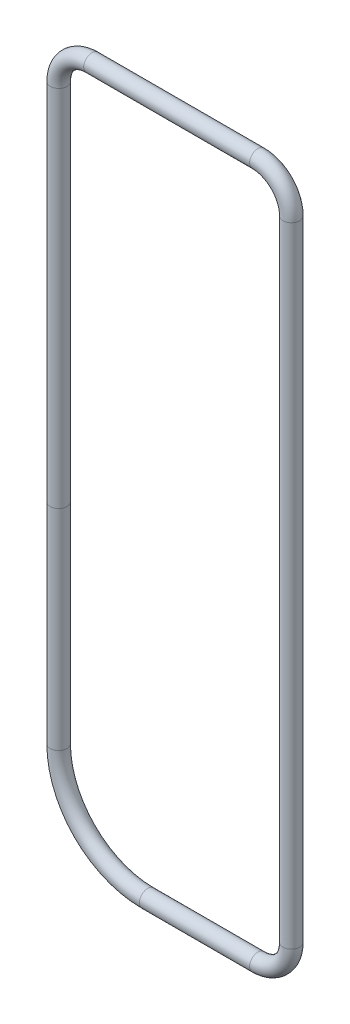
ISO-10303-21;
HEADER;
FILE_DESCRIPTION(('STEP AP214'),'2;1');
FILE_NAME('part.step','',(''),(''),'','','');
FILE_SCHEMA(('AUTOMOTIVE_DESIGN { 1 0 10303 214 1 1 1 1 }'));
ENDSEC;
DATA;
#1=APPLICATION_CONTEXT('core data for automotive mechanical design processes');
#2=APPLICATION_PROTOCOL_DEFINITION('international standard','automotive_design',2000,#1);
#3=PRODUCT_CONTEXT('',#1,'mechanical');
#4=PRODUCT('Part','Part','',(#3));
#5=PRODUCT_RELATED_PRODUCT_CATEGORY('part','',(#4));
#6=PRODUCT_DEFINITION_FORMATION('','',#4);
#7=PRODUCT_DEFINITION_CONTEXT('part definition',#1,'design');
#8=PRODUCT_DEFINITION('design','',#6,#7);
#9=PRODUCT_DEFINITION_SHAPE('','',#8);
#10=(LENGTH_UNIT() NAMED_UNIT(*) SI_UNIT(.MILLI.,.METRE.));
#11=(NAMED_UNIT(*) PLANE_ANGLE_UNIT() SI_UNIT($,.RADIAN.));
#12=(NAMED_UNIT(*) SI_UNIT($,.STERADIAN.) SOLID_ANGLE_UNIT());
#13=UNCERTAINTY_MEASURE_WITH_UNIT(LENGTH_MEASURE(1.E-05),#10,'distance_accuracy_value','');
#14=(GEOMETRIC_REPRESENTATION_CONTEXT(3) GLOBAL_UNCERTAINTY_ASSIGNED_CONTEXT((#13)) GLOBAL_UNIT_ASSIGNED_CONTEXT((#10,
#11,#12)) REPRESENTATION_CONTEXT('',''));
#15=CARTESIAN_POINT('',(0.,0.,0.));
#16=DIRECTION('',(0.,0.,1.));
#17=DIRECTION('',(1.,0.,0.));
#18=AXIS2_PLACEMENT_3D('',#15,#16,#17);
#19=CARTESIAN_POINT('',(-23.2360217079973,-37.6419311072586,0.));
#20=DIRECTION('',(0.,1.,0.));
#21=DIRECTION('',(0.,0.,1.));
#22=AXIS2_PLACEMENT_3D('',#19,#20,#21);
#23=CYLINDRICAL_SURFACE('',#22,1.5);
#24=CARTESIAN_POINT('',(-23.2360217079973,0.,0.));
#25=DIRECTION('',(0.,1.,0.));
#26=DIRECTION('',(0.,0.,1.));
#27=AXIS2_PLACEMENT_3D('',#24,#25,#26);
#28=CIRCLE('',#27,1.5);
#29=CARTESIAN_POINT('',(-23.2360217079973,0.,1.5));
#30=VERTEX_POINT('',#29);
#31=EDGE_CURVE('E67',#30,#30,#28,.T.);
#32=ORIENTED_EDGE('',*,*,#31,.F.);
#33=EDGE_LOOP('',(#32));
#34=FACE_BOUND('',#33,.T.);
#35=CARTESIAN_POINT('',(-23.2360217079973,-37.6419311072586,0.));
#36=DIRECTION('',(0.,1.,0.));
#37=DIRECTION('',(0.,0.,1.));
#38=AXIS2_PLACEMENT_3D('',#35,#36,#37);
#39=CIRCLE('',#38,1.5);
#40=CARTESIAN_POINT('',(-24.7360217079973,-37.6419311072586,0.));
#41=VERTEX_POINT('',#40);
#42=EDGE_CURVE('E10',#41,#41,#39,.T.);
#43=ORIENTED_EDGE('',*,*,#42,.T.);
#44=EDGE_LOOP('',(#43));
#45=FACE_BOUND('',#44,.T.);
#46=ADVANCED_FACE('F36',(#34,#45),#23,.T.);
#47=CARTESIAN_POINT('',(-7.23602170799728,-37.6419311072586,0.));
#48=DIRECTION('',(0.,0.,-1.));
#49=DIRECTION('',(-1.,0.,0.));
#50=AXIS2_PLACEMENT_3D('',#47,#48,#49);
#51=TOROIDAL_SURFACE('',#50,16.,1.5);
#52=CARTESIAN_POINT('',(-7.23602170799728,-53.6419311072586,0.));
#53=DIRECTION('',(-1.,0.,0.));
#54=DIRECTION('',(0.,0.,1.));
#55=AXIS2_PLACEMENT_3D('',#52,#53,#54);
#56=CIRCLE('',#55,1.5);
#57=CARTESIAN_POINT('',(-7.23602170799728,-55.1419311072586,0.));
#58=VERTEX_POINT('',#57);
#59=EDGE_CURVE('E42',#58,#58,#56,.T.);
#60=CARTESIAN_POINT('',(-7.23602170799728,-37.6419311072586,0.));
#61=DIRECTION('',(0.,0.,-1.));
#62=DIRECTION('',(-1.,0.,0.));
#63=AXIS2_PLACEMENT_3D('',#60,#61,#62);
#64=CIRCLE('',#63,17.5);
#65=EDGE_CURVE('',#58,#41,#64,.T.);
#66=ORIENTED_EDGE('',*,*,#59,.T.);
#67=ORIENTED_EDGE('',*,*,#42,.F.);
#68=ORIENTED_EDGE('',*,*,#65,.T.);
#69=ORIENTED_EDGE('',*,*,#65,.F.);
#70=EDGE_LOOP('',(#66,#68,#67,#69));
#71=FACE_BOUND('',#70,.T.);
#72=ADVANCED_FACE('F74',(#71),#51,.T.);
#73=CARTESIAN_POINT('',(12.5639782920027,-53.6419311072586,0.));
#74=DIRECTION('',(-1.,0.,0.));
#75=DIRECTION('',(0.,0.,1.));
#76=AXIS2_PLACEMENT_3D('',#73,#74,#75);
#77=CYLINDRICAL_SURFACE('',#76,1.5);
#78=ORIENTED_EDGE('',*,*,#59,.F.);
#79=EDGE_LOOP('',(#78));
#80=FACE_BOUND('',#79,.T.);
#81=CARTESIAN_POINT('',(12.5639782920027,-53.6419311072586,0.));
#82=DIRECTION('',(-1.,0.,0.));
#83=DIRECTION('',(0.,0.,1.));
#84=AXIS2_PLACEMENT_3D('',#81,#82,#83);
#85=CIRCLE('',#84,1.5);
#86=CARTESIAN_POINT('',(12.5639782920027,-55.1419311072586,0.));
#87=VERTEX_POINT('',#86);
#88=EDGE_CURVE('E46',#87,#87,#85,.T.);
#89=ORIENTED_EDGE('',*,*,#88,.T.);
#90=EDGE_LOOP('',(#89));
#91=FACE_BOUND('',#90,.T.);
#92=ADVANCED_FACE('F78',(#80,#91),#77,.T.);
#93=CARTESIAN_POINT('',(12.5639782920027,-47.6419311072586,0.));
#94=DIRECTION('',(0.,0.,-1.));
#95=DIRECTION('',(-1.,0.,0.));
#96=AXIS2_PLACEMENT_3D('',#93,#94,#95);
#97=TOROIDAL_SURFACE('',#96,5.99999999999999,1.5);
#98=CARTESIAN_POINT('',(18.5639782920027,-47.6419311072586,0.));
#99=DIRECTION('',(0.,-1.,0.));
#100=DIRECTION('',(0.,0.,1.));
#101=AXIS2_PLACEMENT_3D('',#98,#99,#100);
#102=CIRCLE('',#101,1.5);
#103=CARTESIAN_POINT('',(20.0639782920027,-47.6419311072586,0.));
#104=VERTEX_POINT('',#103);
#105=EDGE_CURVE('E50',#104,#104,#102,.T.);
#106=CARTESIAN_POINT('',(12.5639782920027,-47.6419311072586,0.));
#107=DIRECTION('',(0.,0.,-1.));
#108=DIRECTION('',(-1.,0.,0.));
#109=AXIS2_PLACEMENT_3D('',#106,#107,#108);
#110=CIRCLE('',#109,7.49999999999999);
#111=EDGE_CURVE('',#104,#87,#110,.T.);
#112=ORIENTED_EDGE('',*,*,#105,.T.);
#113=ORIENTED_EDGE('',*,*,#88,.F.);
#114=ORIENTED_EDGE('',*,*,#111,.T.);
#115=ORIENTED_EDGE('',*,*,#111,.F.);
#116=EDGE_LOOP('',(#112,#114,#113,#115));
#117=FACE_BOUND('',#116,.T.);
#118=ADVANCED_FACE('F83',(#117),#97,.T.);
#119=CARTESIAN_POINT('',(18.5639782920027,65.3580688927415,0.));
#120=DIRECTION('',(0.,-1.,0.));
#121=DIRECTION('',(0.,0.,-1.));
#122=AXIS2_PLACEMENT_3D('',#119,#120,#121);
#123=CYLINDRICAL_SURFACE('',#122,1.5);
#124=ORIENTED_EDGE('',*,*,#105,.F.);
#125=EDGE_LOOP('',(#124));
#126=FACE_BOUND('',#125,.T.);
#127=CARTESIAN_POINT('',(18.5639782920027,65.3580688927415,0.));
#128=DIRECTION('',(0.,-1.,0.));
#129=DIRECTION('',(0.,0.,1.));
#130=AXIS2_PLACEMENT_3D('',#127,#128,#129);
#131=CIRCLE('',#130,1.5);
#132=CARTESIAN_POINT('',(20.0639782920027,65.3580688927415,0.));
#133=VERTEX_POINT('',#132);
#134=EDGE_CURVE('E55',#133,#133,#131,.T.);
#135=ORIENTED_EDGE('',*,*,#134,.T.);
#136=EDGE_LOOP('',(#135));
#137=FACE_BOUND('',#136,.T.);
#138=ADVANCED_FACE('F89',(#126,#137),#123,.T.);
#139=CARTESIAN_POINT('',(12.5639782920027,65.3580688927415,0.));
#140=DIRECTION('',(0.,0.,-1.));
#141=DIRECTION('',(-1.,0.,0.));
#142=AXIS2_PLACEMENT_3D('',#139,#140,#141);
#143=TOROIDAL_SURFACE('',#142,5.99999999999999,1.5);
#144=CARTESIAN_POINT('',(12.5639782920027,71.3580688927415,0.));
#145=DIRECTION('',(1.,0.,0.));
#146=DIRECTION('',(0.,0.,1.));
#147=AXIS2_PLACEMENT_3D('',#144,#145,#146);
#148=CIRCLE('',#147,1.5);
#149=CARTESIAN_POINT('',(12.5639782920027,72.8580688927414,0.));
#150=VERTEX_POINT('',#149);
#151=EDGE_CURVE('E58',#150,#150,#148,.T.);
#152=CARTESIAN_POINT('',(12.5639782920027,65.3580688927415,0.));
#153=DIRECTION('',(0.,0.,-1.));
#154=DIRECTION('',(-1.,0.,0.));
#155=AXIS2_PLACEMENT_3D('',#152,#153,#154);
#156=CIRCLE('',#155,7.49999999999999);
#157=EDGE_CURVE('',#150,#133,#156,.T.);
#158=ORIENTED_EDGE('',*,*,#151,.T.);
#159=ORIENTED_EDGE('',*,*,#134,.F.);
#160=ORIENTED_EDGE('',*,*,#157,.T.);
#161=ORIENTED_EDGE('',*,*,#157,.F.);
#162=EDGE_LOOP('',(#158,#160,#159,#161));
#163=FACE_BOUND('',#162,.T.);
#164=ADVANCED_FACE('F93',(#163),#143,.T.);
#165=CARTESIAN_POINT('',(-17.2360217079973,71.3580688927415,0.));
#166=DIRECTION('',(1.,0.,0.));
#167=DIRECTION('',(0.,0.,-1.));
#168=AXIS2_PLACEMENT_3D('',#165,#166,#167);
#169=CYLINDRICAL_SURFACE('',#168,1.5);
#170=ORIENTED_EDGE('',*,*,#151,.F.);
#171=EDGE_LOOP('',(#170));
#172=FACE_BOUND('',#171,.T.);
#173=CARTESIAN_POINT('',(-17.2360217079973,71.3580688927415,0.));
#174=DIRECTION('',(1.,0.,0.));
#175=DIRECTION('',(0.,0.,1.));
#176=AXIS2_PLACEMENT_3D('',#173,#174,#175);
#177=CIRCLE('',#176,1.5);
#178=CARTESIAN_POINT('',(-17.2360217079973,72.8580688927415,0.));
#179=VERTEX_POINT('',#178);
#180=EDGE_CURVE('E61',#179,#179,#177,.T.);
#181=ORIENTED_EDGE('',*,*,#180,.T.);
#182=EDGE_LOOP('',(#181));
#183=FACE_BOUND('',#182,.T.);
#184=ADVANCED_FACE('F97',(#172,#183),#169,.T.);
#185=CARTESIAN_POINT('',(-17.2360217079973,65.3580688927415,0.));
#186=DIRECTION('',(0.,0.,-1.));
#187=DIRECTION('',(-1.,0.,0.));
#188=AXIS2_PLACEMENT_3D('',#185,#186,#187);
#189=TOROIDAL_SURFACE('',#188,6.00000000000001,1.5);
#190=CARTESIAN_POINT('',(-23.2360217079973,65.3580688927415,0.));
#191=DIRECTION('',(0.,1.,0.));
#192=DIRECTION('',(0.,0.,1.));
#193=AXIS2_PLACEMENT_3D('',#190,#191,#192);
#194=CIRCLE('',#193,1.5);
#195=CARTESIAN_POINT('',(-24.7360217079973,65.3580688927415,0.));
#196=VERTEX_POINT('',#195);
#197=EDGE_CURVE('E64',#196,#196,#194,.T.);
#198=CARTESIAN_POINT('',(-17.2360217079973,65.3580688927415,0.));
#199=DIRECTION('',(0.,0.,-1.));
#200=DIRECTION('',(-1.,0.,0.));
#201=AXIS2_PLACEMENT_3D('',#198,#199,#200);
#202=CIRCLE('',#201,7.50000000000001);
#203=EDGE_CURVE('',#196,#179,#202,.T.);
#204=ORIENTED_EDGE('',*,*,#197,.T.);
#205=ORIENTED_EDGE('',*,*,#180,.F.);
#206=ORIENTED_EDGE('',*,*,#203,.T.);
#207=ORIENTED_EDGE('',*,*,#203,.F.);
#208=EDGE_LOOP('',(#204,#206,#205,#207));
#209=FACE_BOUND('',#208,.T.);
#210=ADVANCED_FACE('F101',(#209),#189,.T.);
#211=CARTESIAN_POINT('',(-23.2360217079973,0.,0.));
#212=DIRECTION('',(0.,1.,0.));
#213=DIRECTION('',(0.,0.,1.));
#214=AXIS2_PLACEMENT_3D('',#211,#212,#213);
#215=CYLINDRICAL_SURFACE('',#214,1.5);
#216=ORIENTED_EDGE('',*,*,#197,.F.);
#217=EDGE_LOOP('',(#216));
#218=FACE_BOUND('',#217,.T.);
#219=ORIENTED_EDGE('',*,*,#31,.T.);
#220=EDGE_LOOP('',(#219));
#221=FACE_BOUND('',#220,.T.);
#222=ADVANCED_FACE('F71',(#218,#221),#215,.T.);
#223=CLOSED_SHELL('',(#46,#72,#92,#118,#138,#164,#184,#210,#222));
#224=MANIFOLD_SOLID_BREP('B2',#223);
#225=ADVANCED_BREP_SHAPE_REPRESENTATION('',(#18,#224),#14);
#226=SHAPE_DEFINITION_REPRESENTATION(#9,#225);
ENDSEC;
END-ISO-10303-21;
